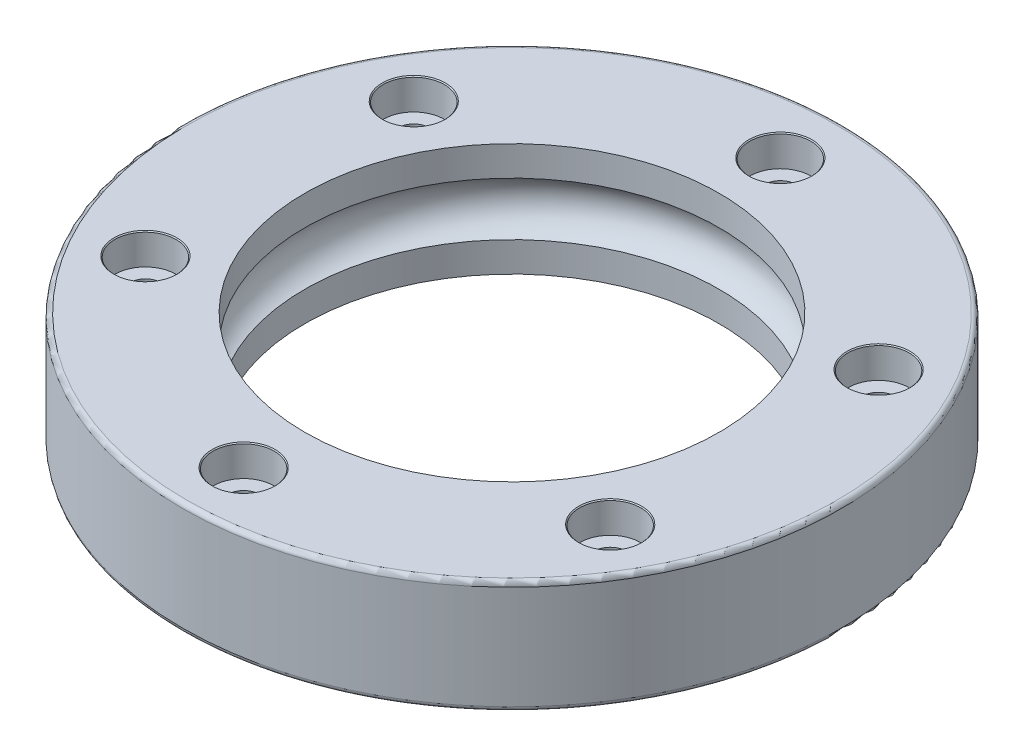
ISO-10303-21;
HEADER;
FILE_DESCRIPTION(('STEP AP214'),'2;1');
FILE_NAME('part.step','',(''),(''),'','','');
FILE_SCHEMA(('AUTOMOTIVE_DESIGN { 1 0 10303 214 1 1 1 1 }'));
ENDSEC;
DATA;
#1=APPLICATION_CONTEXT('core data for automotive mechanical design processes');
#2=APPLICATION_PROTOCOL_DEFINITION('international standard','automotive_design',2000,#1);
#3=PRODUCT_CONTEXT('',#1,'mechanical');
#4=PRODUCT('Part','Part','',(#3));
#5=PRODUCT_RELATED_PRODUCT_CATEGORY('part','',(#4));
#6=PRODUCT_DEFINITION_FORMATION('','',#4);
#7=PRODUCT_DEFINITION_CONTEXT('part definition',#1,'design');
#8=PRODUCT_DEFINITION('design','',#6,#7);
#9=PRODUCT_DEFINITION_SHAPE('','',#8);
#10=(LENGTH_UNIT() NAMED_UNIT(*) SI_UNIT(.MILLI.,.METRE.));
#11=(NAMED_UNIT(*) PLANE_ANGLE_UNIT() SI_UNIT($,.RADIAN.));
#12=(NAMED_UNIT(*) SI_UNIT($,.STERADIAN.) SOLID_ANGLE_UNIT());
#13=UNCERTAINTY_MEASURE_WITH_UNIT(LENGTH_MEASURE(1.E-05),#10,'distance_accuracy_value','');
#14=(GEOMETRIC_REPRESENTATION_CONTEXT(3) GLOBAL_UNCERTAINTY_ASSIGNED_CONTEXT((#13)) GLOBAL_UNIT_ASSIGNED_CONTEXT((#10,
#11,#12)) REPRESENTATION_CONTEXT('',''));
#15=CARTESIAN_POINT('',(0.,0.,0.));
#16=DIRECTION('',(0.,0.,1.));
#17=DIRECTION('',(1.,0.,0.));
#18=AXIS2_PLACEMENT_3D('',#15,#16,#17);
#19=CARTESIAN_POINT('',(-24.6817240078559,-14.,-14.2499999999989));
#20=DIRECTION('',(0.,1.,0.));
#21=DIRECTION('',(0.,0.,1.));
#22=AXIS2_PLACEMENT_3D('',#19,#20,#21);
#23=CYLINDRICAL_SURFACE('',#22,1.70000000000123);
#24=CARTESIAN_POINT('',(-24.6817240078559,-6.,-14.2499999999989));
#25=DIRECTION('',(0.,-1.,0.));
#26=DIRECTION('',(0.,0.,-1.));
#27=AXIS2_PLACEMENT_3D('',#24,#25,#26);
#28=CIRCLE('',#27,1.70000000000123);
#29=CARTESIAN_POINT('',(-24.6817240078559,-6.,-15.9500000000002));
#30=VERTEX_POINT('',#29);
#31=EDGE_CURVE('E97',#30,#30,#28,.T.);
#32=ORIENTED_EDGE('',*,*,#31,.T.);
#33=EDGE_LOOP('',(#32));
#34=FACE_BOUND('',#33,.T.);
#35=CARTESIAN_POINT('',(-24.6817240078559,2.7,-14.2499999999989));
#36=DIRECTION('',(0.,1.,0.));
#37=DIRECTION('',(0.,0.,1.));
#38=AXIS2_PLACEMENT_3D('',#35,#36,#37);
#39=CIRCLE('',#38,1.70000000000123);
#40=CARTESIAN_POINT('',(-24.6817240078559,2.7,-12.5499999999977));
#41=VERTEX_POINT('',#40);
#42=EDGE_CURVE('E77',#41,#41,#39,.F.);
#43=ORIENTED_EDGE('',*,*,#42,.F.);
#44=EDGE_LOOP('',(#43));
#45=FACE_BOUND('',#44,.T.);
#46=ADVANCED_FACE('F32',(#34,#45),#23,.F.);
#47=CARTESIAN_POINT('',(-24.6817240078547,-14.,14.2500000000011));
#48=DIRECTION('',(0.,1.,0.));
#49=DIRECTION('',(0.,0.,1.));
#50=AXIS2_PLACEMENT_3D('',#47,#48,#49);
#51=CYLINDRICAL_SURFACE('',#50,1.70000000000231);
#52=CARTESIAN_POINT('',(-24.6817240078547,-6.,14.2500000000011));
#53=DIRECTION('',(0.,-1.,0.));
#54=DIRECTION('',(0.,0.,-1.));
#55=AXIS2_PLACEMENT_3D('',#52,#53,#54);
#56=CIRCLE('',#55,1.70000000000231);
#57=CARTESIAN_POINT('',(-24.6817240078547,-6.,12.5499999999988));
#58=VERTEX_POINT('',#57);
#59=EDGE_CURVE('E133',#58,#58,#56,.T.);
#60=ORIENTED_EDGE('',*,*,#59,.T.);
#61=EDGE_LOOP('',(#60));
#62=FACE_BOUND('',#61,.T.);
#63=CARTESIAN_POINT('',(-24.6817240078547,2.7,14.2500000000011));
#64=DIRECTION('',(0.,1.,0.));
#65=DIRECTION('',(0.,0.,1.));
#66=AXIS2_PLACEMENT_3D('',#63,#64,#65);
#67=CIRCLE('',#66,1.70000000000231);
#68=CARTESIAN_POINT('',(-24.6817240078547,2.7,15.9500000000034));
#69=VERTEX_POINT('',#68);
#70=EDGE_CURVE('E81',#69,#69,#67,.F.);
#71=ORIENTED_EDGE('',*,*,#70,.F.);
#72=EDGE_LOOP('',(#71));
#73=FACE_BOUND('',#72,.T.);
#74=ADVANCED_FACE('F173',(#62,#73),#51,.F.);
#75=CARTESIAN_POINT('',(2.4230756695444E-12,-14.,28.5));
#76=DIRECTION('',(0.,1.,0.));
#77=DIRECTION('',(0.,0.,1.));
#78=AXIS2_PLACEMENT_3D('',#75,#76,#77);
#79=CYLINDRICAL_SURFACE('',#78,1.70000000000251);
#80=CARTESIAN_POINT('',(2.4230756695444E-12,-6.,28.5));
#81=DIRECTION('',(0.,-1.,0.));
#82=DIRECTION('',(0.,0.,-1.));
#83=AXIS2_PLACEMENT_3D('',#80,#81,#82);
#84=CIRCLE('',#83,1.70000000000251);
#85=CARTESIAN_POINT('',(2.4230756695444E-12,-6.,26.7999999999975));
#86=VERTEX_POINT('',#85);
#87=EDGE_CURVE('E130',#86,#86,#84,.T.);
#88=ORIENTED_EDGE('',*,*,#87,.T.);
#89=EDGE_LOOP('',(#88));
#90=FACE_BOUND('',#89,.T.);
#91=CARTESIAN_POINT('',(2.4230756695444E-12,2.7,28.5));
#92=DIRECTION('',(0.,1.,0.));
#93=DIRECTION('',(0.,0.,1.));
#94=AXIS2_PLACEMENT_3D('',#91,#92,#93);
#95=CIRCLE('',#94,1.70000000000251);
#96=CARTESIAN_POINT('',(2.4230756695444E-12,2.7,30.2000000000025));
#97=VERTEX_POINT('',#96);
#98=EDGE_CURVE('E84',#97,#97,#95,.F.);
#99=ORIENTED_EDGE('',*,*,#98,.F.);
#100=EDGE_LOOP('',(#99));
#101=FACE_BOUND('',#100,.T.);
#102=ADVANCED_FACE('F179',(#90,#101),#79,.F.);
#103=CARTESIAN_POINT('',(24.6817240078583,-14.,14.2499999999989));
#104=DIRECTION('',(0.,1.,0.));
#105=DIRECTION('',(0.,0.,1.));
#106=AXIS2_PLACEMENT_3D('',#103,#104,#105);
#107=CYLINDRICAL_SURFACE('',#106,1.70000000000156);
#108=CARTESIAN_POINT('',(24.6817240078583,-6.,14.2499999999989));
#109=DIRECTION('',(0.,-1.,0.));
#110=DIRECTION('',(0.,0.,-1.));
#111=AXIS2_PLACEMENT_3D('',#108,#109,#110);
#112=CIRCLE('',#111,1.70000000000156);
#113=CARTESIAN_POINT('',(24.6817240078583,-6.,12.5499999999974));
#114=VERTEX_POINT('',#113);
#115=EDGE_CURVE('E127',#114,#114,#112,.T.);
#116=ORIENTED_EDGE('',*,*,#115,.T.);
#117=EDGE_LOOP('',(#116));
#118=FACE_BOUND('',#117,.T.);
#119=CARTESIAN_POINT('',(24.6817240078583,2.7,14.2499999999989));
#120=DIRECTION('',(0.,1.,0.));
#121=DIRECTION('',(0.,0.,1.));
#122=AXIS2_PLACEMENT_3D('',#119,#120,#121);
#123=CIRCLE('',#122,1.70000000000156);
#124=CARTESIAN_POINT('',(24.6817240078583,2.7,15.9500000000005));
#125=VERTEX_POINT('',#124);
#126=EDGE_CURVE('E87',#125,#125,#123,.F.);
#127=ORIENTED_EDGE('',*,*,#126,.F.);
#128=EDGE_LOOP('',(#127));
#129=FACE_BOUND('',#128,.T.);
#130=ADVANCED_FACE('F419',(#118,#129),#107,.F.);
#131=CARTESIAN_POINT('',(24.6817240078571,-14.,-14.2500000000011));
#132=DIRECTION('',(0.,1.,0.));
#133=DIRECTION('',(0.,0.,1.));
#134=AXIS2_PLACEMENT_3D('',#131,#132,#133);
#135=CYLINDRICAL_SURFACE('',#134,1.70000000000034);
#136=CARTESIAN_POINT('',(24.6817240078571,-6.,-14.2500000000011));
#137=DIRECTION('',(0.,-1.,0.));
#138=DIRECTION('',(0.,0.,-1.));
#139=AXIS2_PLACEMENT_3D('',#136,#137,#138);
#140=CIRCLE('',#139,1.70000000000034);
#141=CARTESIAN_POINT('',(24.6817240078571,-6.,-15.9500000000014));
#142=VERTEX_POINT('',#141);
#143=EDGE_CURVE('E124',#142,#142,#140,.T.);
#144=ORIENTED_EDGE('',*,*,#143,.T.);
#145=EDGE_LOOP('',(#144));
#146=FACE_BOUND('',#145,.T.);
#147=CARTESIAN_POINT('',(24.6817240078571,2.7,-14.2500000000011));
#148=DIRECTION('',(0.,1.,0.));
#149=DIRECTION('',(0.,0.,1.));
#150=AXIS2_PLACEMENT_3D('',#147,#148,#149);
#151=CIRCLE('',#150,1.70000000000034);
#152=CARTESIAN_POINT('',(24.6817240078571,2.7,-12.5500000000007));
#153=VERTEX_POINT('',#152);
#154=EDGE_CURVE('E90',#153,#153,#151,.F.);
#155=ORIENTED_EDGE('',*,*,#154,.F.);
#156=EDGE_LOOP('',(#155));
#157=FACE_BOUND('',#156,.T.);
#158=ADVANCED_FACE('F189',(#146,#157),#135,.F.);
#159=CARTESIAN_POINT('',(0.,-14.,-28.5));
#160=DIRECTION('',(0.,1.,0.));
#161=DIRECTION('',(0.,0.,1.));
#162=AXIS2_PLACEMENT_3D('',#159,#160,#161);
#163=CYLINDRICAL_SURFACE('',#162,1.7);
#164=CARTESIAN_POINT('',(0.,-6.,-28.5));
#165=DIRECTION('',(0.,-1.,0.));
#166=DIRECTION('',(0.,0.,-1.));
#167=AXIS2_PLACEMENT_3D('',#164,#165,#166);
#168=CIRCLE('',#167,1.7);
#169=CARTESIAN_POINT('',(0.,-6.,-30.2));
#170=VERTEX_POINT('',#169);
#171=EDGE_CURVE('E121',#170,#170,#168,.T.);
#172=ORIENTED_EDGE('',*,*,#171,.T.);
#173=EDGE_LOOP('',(#172));
#174=FACE_BOUND('',#173,.T.);
#175=CARTESIAN_POINT('',(0.,2.7,-28.5));
#176=DIRECTION('',(0.,1.,0.));
#177=DIRECTION('',(0.,0.,1.));
#178=AXIS2_PLACEMENT_3D('',#175,#176,#177);
#179=CIRCLE('',#178,1.7);
#180=CARTESIAN_POINT('',(0.,2.7,-26.8));
#181=VERTEX_POINT('',#180);
#182=EDGE_CURVE('E94',#181,#181,#179,.F.);
#183=ORIENTED_EDGE('',*,*,#182,.F.);
#184=EDGE_LOOP('',(#183));
#185=FACE_BOUND('',#184,.T.);
#186=ADVANCED_FACE('F185',(#174,#185),#163,.F.);
#187=CARTESIAN_POINT('',(-22.,-6.,0.));
#188=DIRECTION('',(0.,-1.,0.));
#189=DIRECTION('',(0.,0.,-1.));
#190=AXIS2_PLACEMENT_3D('',#187,#188,#189);
#191=PLANE('',#190);
#192=ORIENTED_EDGE('',*,*,#143,.F.);
#193=EDGE_LOOP('',(#192));
#194=FACE_BOUND('',#193,.T.);
#195=ORIENTED_EDGE('',*,*,#115,.F.);
#196=EDGE_LOOP('',(#195));
#197=FACE_BOUND('',#196,.T.);
#198=ORIENTED_EDGE('',*,*,#87,.F.);
#199=EDGE_LOOP('',(#198));
#200=FACE_BOUND('',#199,.T.);
#201=ORIENTED_EDGE('',*,*,#59,.F.);
#202=EDGE_LOOP('',(#201));
#203=FACE_BOUND('',#202,.T.);
#204=ORIENTED_EDGE('',*,*,#31,.F.);
#205=EDGE_LOOP('',(#204));
#206=FACE_BOUND('',#205,.T.);
#207=ORIENTED_EDGE('',*,*,#171,.F.);
#208=EDGE_LOOP('',(#207));
#209=FACE_BOUND('',#208,.T.);
#210=CARTESIAN_POINT('',(0.,-6.,0.));
#211=DIRECTION('',(0.,-1.,0.));
#212=DIRECTION('',(0.,0.,-1.));
#213=AXIS2_PLACEMENT_3D('',#210,#211,#212);
#214=CIRCLE('',#213,34.5);
#215=CARTESIAN_POINT('',(0.,-6.,-34.5));
#216=VERTEX_POINT('',#215);
#217=EDGE_CURVE('E100',#216,#216,#214,.T.);
#218=ORIENTED_EDGE('',*,*,#217,.T.);
#219=EDGE_LOOP('',(#218));
#220=FACE_BOUND('',#219,.T.);
#221=CARTESIAN_POINT('',(0.,-6.,0.));
#222=DIRECTION('',(0.,1.,0.));
#223=DIRECTION('',(0.,0.,1.));
#224=AXIS2_PLACEMENT_3D('',#221,#222,#223);
#225=CIRCLE('',#224,22.);
#226=CARTESIAN_POINT('',(0.,-6.,22.));
#227=VERTEX_POINT('',#226);
#228=EDGE_CURVE('E109',#227,#227,#225,.T.);
#229=ORIENTED_EDGE('',*,*,#228,.T.);
#230=EDGE_LOOP('',(#229));
#231=FACE_BOUND('',#230,.T.);
#232=ADVANCED_FACE('F188',(#194,#197,#200,#203,#206,#209,#220,#231),#191,.T.);
#233=CARTESIAN_POINT('',(0.,15.8769514141379,0.));
#234=DIRECTION('',(0.,1.,0.));
#235=DIRECTION('',(0.,0.,1.));
#236=AXIS2_PLACEMENT_3D('',#233,#234,#235);
#237=CYLINDRICAL_SURFACE('',#236,22.);
#238=CARTESIAN_POINT('',(0.,-2.82842712474619,0.));
#239=DIRECTION('',(0.,1.,0.));
#240=DIRECTION('',(0.,0.,1.));
#241=AXIS2_PLACEMENT_3D('',#238,#239,#240);
#242=CIRCLE('',#241,22.);
#243=CARTESIAN_POINT('',(0.,-2.82842712474619,22.));
#244=VERTEX_POINT('',#243);
#245=EDGE_CURVE('E112',#244,#244,#242,.T.);
#246=ORIENTED_EDGE('',*,*,#245,.T.);
#247=EDGE_LOOP('',(#246));
#248=FACE_BOUND('',#247,.T.);
#249=ORIENTED_EDGE('',*,*,#228,.F.);
#250=EDGE_LOOP('',(#249));
#251=FACE_BOUND('',#250,.T.);
#252=ADVANCED_FACE('F207',(#248,#251),#237,.F.);
#253=CARTESIAN_POINT('',(0.,0.,0.));
#254=DIRECTION('',(0.,1.,0.));
#255=DIRECTION('',(0.,0.,1.));
#256=AXIS2_PLACEMENT_3D('',#253,#254,#255);
#257=TOROIDAL_SURFACE('',#256,21.,3.);
#258=CARTESIAN_POINT('',(0.,2.82842712474619,0.));
#259=DIRECTION('',(0.,1.,0.));
#260=DIRECTION('',(0.,0.,1.));
#261=AXIS2_PLACEMENT_3D('',#258,#259,#260);
#262=CIRCLE('',#261,22.);
#263=CARTESIAN_POINT('',(0.,2.82842712474619,22.));
#264=VERTEX_POINT('',#263);
#265=EDGE_CURVE('E115',#264,#264,#262,.T.);
#266=ORIENTED_EDGE('',*,*,#265,.T.);
#267=EDGE_LOOP('',(#266));
#268=FACE_BOUND('',#267,.T.);
#269=ORIENTED_EDGE('',*,*,#245,.F.);
#270=EDGE_LOOP('',(#269));
#271=FACE_BOUND('',#270,.T.);
#272=ADVANCED_FACE('F203',(#268,#271),#257,.F.);
#273=CARTESIAN_POINT('',(0.,15.8769514141379,0.));
#274=DIRECTION('',(0.,1.,0.));
#275=DIRECTION('',(0.,0.,1.));
#276=AXIS2_PLACEMENT_3D('',#273,#274,#275);
#277=CYLINDRICAL_SURFACE('',#276,22.);
#278=CARTESIAN_POINT('',(0.,6.,0.));
#279=DIRECTION('',(0.,1.,0.));
#280=DIRECTION('',(0.,0.,1.));
#281=AXIS2_PLACEMENT_3D('',#278,#279,#280);
#282=CIRCLE('',#281,22.);
#283=CARTESIAN_POINT('',(0.,6.,22.));
#284=VERTEX_POINT('',#283);
#285=EDGE_CURVE('E118',#284,#284,#282,.T.);
#286=ORIENTED_EDGE('',*,*,#285,.T.);
#287=EDGE_LOOP('',(#286));
#288=FACE_BOUND('',#287,.T.);
#289=ORIENTED_EDGE('',*,*,#265,.F.);
#290=EDGE_LOOP('',(#289));
#291=FACE_BOUND('',#290,.T.);
#292=ADVANCED_FACE('F199',(#288,#291),#277,.F.);
#293=CARTESIAN_POINT('',(-22.,6.,0.));
#294=DIRECTION('',(0.,1.,0.));
#295=DIRECTION('',(0.,0.,1.));
#296=AXIS2_PLACEMENT_3D('',#293,#294,#295);
#297=PLANE('',#296);
#298=CARTESIAN_POINT('',(24.6817240078583,6.,14.2499999999989));
#299=DIRECTION('',(0.,1.,0.));
#300=DIRECTION('',(0.,0.,1.));
#301=AXIS2_PLACEMENT_3D('',#298,#299,#300);
#302=CIRCLE('',#301,3.35000000000157);
#303=CARTESIAN_POINT('',(24.6817240078583,6.,17.6000000000005));
#304=VERTEX_POINT('',#303);
#305=EDGE_CURVE('E55',#304,#304,#302,.F.);
#306=ORIENTED_EDGE('',*,*,#305,.T.);
#307=EDGE_LOOP('',(#306));
#308=FACE_BOUND('',#307,.T.);
#309=CARTESIAN_POINT('',(24.6817240078571,6.,-14.2500000000011));
#310=DIRECTION('',(0.,1.,0.));
#311=DIRECTION('',(0.,0.,1.));
#312=AXIS2_PLACEMENT_3D('',#309,#310,#311);
#313=CIRCLE('',#312,3.35000000000037);
#314=CARTESIAN_POINT('',(24.6817240078571,6.,-10.9000000000007));
#315=VERTEX_POINT('',#314);
#316=EDGE_CURVE('E58',#315,#315,#313,.F.);
#317=ORIENTED_EDGE('',*,*,#316,.T.);
#318=EDGE_LOOP('',(#317));
#319=FACE_BOUND('',#318,.T.);
#320=CARTESIAN_POINT('',(0.,6.,-28.5));
#321=DIRECTION('',(0.,1.,0.));
#322=DIRECTION('',(0.,0.,1.));
#323=AXIS2_PLACEMENT_3D('',#320,#321,#322);
#324=CIRCLE('',#323,3.35);
#325=CARTESIAN_POINT('',(0.,6.,-25.15));
#326=VERTEX_POINT('',#325);
#327=EDGE_CURVE('E61',#326,#326,#324,.F.);
#328=ORIENTED_EDGE('',*,*,#327,.T.);
#329=EDGE_LOOP('',(#328));
#330=FACE_BOUND('',#329,.T.);
#331=CARTESIAN_POINT('',(-24.6817240078559,6.,-14.2499999999989));
#332=DIRECTION('',(0.,1.,0.));
#333=DIRECTION('',(0.,0.,1.));
#334=AXIS2_PLACEMENT_3D('',#331,#332,#333);
#335=CIRCLE('',#334,3.35000000000124);
#336=CARTESIAN_POINT('',(-24.6817240078559,6.,-10.8999999999977));
#337=VERTEX_POINT('',#336);
#338=EDGE_CURVE('E64',#337,#337,#335,.F.);
#339=ORIENTED_EDGE('',*,*,#338,.T.);
#340=EDGE_LOOP('',(#339));
#341=FACE_BOUND('',#340,.T.);
#342=CARTESIAN_POINT('',(-24.6817240078547,6.,14.2500000000011));
#343=DIRECTION('',(0.,1.,0.));
#344=DIRECTION('',(0.,0.,1.));
#345=AXIS2_PLACEMENT_3D('',#342,#343,#344);
#346=CIRCLE('',#345,3.35000000000232);
#347=CARTESIAN_POINT('',(-24.6817240078547,6.,17.6000000000034));
#348=VERTEX_POINT('',#347);
#349=EDGE_CURVE('E67',#348,#348,#346,.F.);
#350=ORIENTED_EDGE('',*,*,#349,.T.);
#351=EDGE_LOOP('',(#350));
#352=FACE_BOUND('',#351,.T.);
#353=CARTESIAN_POINT('',(2.4230756695444E-12,6.,28.5));
#354=DIRECTION('',(0.,1.,0.));
#355=DIRECTION('',(0.,0.,1.));
#356=AXIS2_PLACEMENT_3D('',#353,#354,#355);
#357=CIRCLE('',#356,3.35000000000252);
#358=CARTESIAN_POINT('',(2.4230756695444E-12,6.,31.8500000000025));
#359=VERTEX_POINT('',#358);
#360=EDGE_CURVE('E70',#359,#359,#357,.F.);
#361=ORIENTED_EDGE('',*,*,#360,.T.);
#362=EDGE_LOOP('',(#361));
#363=FACE_BOUND('',#362,.T.);
#364=CARTESIAN_POINT('',(0.,6.,0.));
#365=DIRECTION('',(0.,1.,0.));
#366=DIRECTION('',(0.,0.,1.));
#367=AXIS2_PLACEMENT_3D('',#364,#365,#366);
#368=CIRCLE('',#367,34.5);
#369=CARTESIAN_POINT('',(0.,6.,34.5));
#370=VERTEX_POINT('',#369);
#371=EDGE_CURVE('E76',#370,#370,#368,.T.);
#372=ORIENTED_EDGE('',*,*,#371,.T.);
#373=EDGE_LOOP('',(#372));
#374=FACE_BOUND('',#373,.T.);
#375=ORIENTED_EDGE('',*,*,#285,.F.);
#376=EDGE_LOOP('',(#375));
#377=FACE_BOUND('',#376,.T.);
#378=ADVANCED_FACE('F195',(#308,#319,#330,#341,#352,#363,#374,#377),#297,.T.);
#379=CARTESIAN_POINT('',(0.,15.8769514141379,0.));
#380=DIRECTION('',(0.,1.,0.));
#381=DIRECTION('',(0.,0.,1.));
#382=AXIS2_PLACEMENT_3D('',#379,#380,#381);
#383=CYLINDRICAL_SURFACE('',#382,35.);
#384=CARTESIAN_POINT('',(0.,-5.5,0.));
#385=DIRECTION('',(0.,-1.,0.));
#386=DIRECTION('',(0.,0.,-1.));
#387=AXIS2_PLACEMENT_3D('',#384,#385,#386);
#388=CIRCLE('',#387,35.);
#389=CARTESIAN_POINT('',(0.,-5.5,-35.));
#390=VERTEX_POINT('',#389);
#391=EDGE_CURVE('E103',#390,#390,#388,.F.);
#392=ORIENTED_EDGE('',*,*,#391,.T.);
#393=EDGE_LOOP('',(#392));
#394=FACE_BOUND('',#393,.T.);
#395=CARTESIAN_POINT('',(0.,5.5,0.));
#396=DIRECTION('',(0.,1.,0.));
#397=DIRECTION('',(0.,0.,1.));
#398=AXIS2_PLACEMENT_3D('',#395,#396,#397);
#399=CIRCLE('',#398,35.);
#400=CARTESIAN_POINT('',(0.,5.5,35.));
#401=VERTEX_POINT('',#400);
#402=EDGE_CURVE('E106',#401,#401,#399,.F.);
#403=ORIENTED_EDGE('',*,*,#402,.T.);
#404=EDGE_LOOP('',(#403));
#405=FACE_BOUND('',#404,.T.);
#406=ADVANCED_FACE('F191',(#394,#405),#383,.T.);
#407=CARTESIAN_POINT('',(0.,-5.5,0.));
#408=DIRECTION('',(0.,-1.,0.));
#409=DIRECTION('',(0.,0.,-1.));
#410=AXIS2_PLACEMENT_3D('',#407,#408,#409);
#411=TOROIDAL_SURFACE('',#410,34.5,0.5);
#412=ORIENTED_EDGE('',*,*,#217,.F.);
#413=EDGE_LOOP('',(#412));
#414=FACE_BOUND('',#413,.T.);
#415=ORIENTED_EDGE('',*,*,#391,.F.);
#416=EDGE_LOOP('',(#415));
#417=FACE_BOUND('',#416,.T.);
#418=ADVANCED_FACE('F194',(#414,#417),#411,.T.);
#419=CARTESIAN_POINT('',(0.,5.5,0.));
#420=DIRECTION('',(0.,1.,0.));
#421=DIRECTION('',(0.,0.,1.));
#422=AXIS2_PLACEMENT_3D('',#419,#420,#421);
#423=TOROIDAL_SURFACE('',#422,34.5,0.5);
#424=ORIENTED_EDGE('',*,*,#402,.F.);
#425=EDGE_LOOP('',(#424));
#426=FACE_BOUND('',#425,.T.);
#427=ORIENTED_EDGE('',*,*,#371,.F.);
#428=EDGE_LOOP('',(#427));
#429=FACE_BOUND('',#428,.T.);
#430=ADVANCED_FACE('F217',(#426,#429),#423,.T.);
#431=CARTESIAN_POINT('',(0.,2.7,-28.5));
#432=DIRECTION('',(0.,1.,0.));
#433=DIRECTION('',(0.,0.,1.));
#434=AXIS2_PLACEMENT_3D('',#431,#432,#433);
#435=PLANE('',#434);
#436=CARTESIAN_POINT('',(0.,2.7,-28.5));
#437=DIRECTION('',(0.,1.,0.));
#438=DIRECTION('',(0.,0.,1.));
#439=AXIS2_PLACEMENT_3D('',#436,#437,#438);
#440=CIRCLE('',#439,3.25);
#441=CARTESIAN_POINT('',(0.,2.7,-25.25));
#442=VERTEX_POINT('',#441);
#443=EDGE_CURVE('E80',#442,#442,#440,.T.);
#444=ORIENTED_EDGE('',*,*,#443,.T.);
#445=EDGE_LOOP('',(#444));
#446=FACE_BOUND('',#445,.T.);
#447=ORIENTED_EDGE('',*,*,#182,.T.);
#448=EDGE_LOOP('',(#447));
#449=FACE_BOUND('',#448,.T.);
#450=ADVANCED_FACE('F221',(#446,#449),#435,.T.);
#451=CARTESIAN_POINT('',(0.,2.7,-28.5));
#452=DIRECTION('',(0.,1.,0.));
#453=DIRECTION('',(0.,0.,1.));
#454=AXIS2_PLACEMENT_3D('',#451,#452,#453);
#455=CYLINDRICAL_SURFACE('',#454,3.25);
#456=CARTESIAN_POINT('',(0.,5.89999999999999,-28.5));
#457=DIRECTION('',(0.,1.,0.));
#458=DIRECTION('',(0.,0.,1.));
#459=AXIS2_PLACEMENT_3D('',#456,#457,#458);
#460=CIRCLE('',#459,3.25);
#461=CARTESIAN_POINT('',(0.,5.89999999999999,-25.25));
#462=VERTEX_POINT('',#461);
#463=EDGE_CURVE('E47',#462,#462,#460,.T.);
#464=ORIENTED_EDGE('',*,*,#463,.T.);
#465=EDGE_LOOP('',(#464));
#466=FACE_BOUND('',#465,.T.);
#467=ORIENTED_EDGE('',*,*,#443,.F.);
#468=EDGE_LOOP('',(#467));
#469=FACE_BOUND('',#468,.T.);
#470=ADVANCED_FACE('F170',(#466,#469),#455,.F.);
#471=CARTESIAN_POINT('',(24.6817240078571,2.7,-14.2500000000011));
#472=DIRECTION('',(0.,1.,0.));
#473=DIRECTION('',(0.,0.,1.));
#474=AXIS2_PLACEMENT_3D('',#471,#472,#473);
#475=PLANE('',#474);
#476=CARTESIAN_POINT('',(24.6817240078571,2.7,-14.2500000000011));
#477=DIRECTION('',(0.,1.,0.));
#478=DIRECTION('',(0.,0.,1.));
#479=AXIS2_PLACEMENT_3D('',#476,#477,#478);
#480=CIRCLE('',#479,3.25000000000034);
#481=CARTESIAN_POINT('',(24.6817240078571,2.7,-11.0000000000007));
#482=VERTEX_POINT('',#481);
#483=EDGE_CURVE('E93',#482,#482,#480,.T.);
#484=ORIENTED_EDGE('',*,*,#483,.T.);
#485=EDGE_LOOP('',(#484));
#486=FACE_BOUND('',#485,.T.);
#487=ORIENTED_EDGE('',*,*,#154,.T.);
#488=EDGE_LOOP('',(#487));
#489=FACE_BOUND('',#488,.T.);
#490=ADVANCED_FACE('F155',(#486,#489),#475,.T.);
#491=CARTESIAN_POINT('',(24.6817240078571,2.7,-14.2500000000011));
#492=DIRECTION('',(0.,1.,0.));
#493=DIRECTION('',(0.,0.,1.));
#494=AXIS2_PLACEMENT_3D('',#491,#492,#493);
#495=CYLINDRICAL_SURFACE('',#494,3.25000000000034);
#496=CARTESIAN_POINT('',(24.6817240078571,5.89999999999999,-14.2500000000011));
#497=DIRECTION('',(0.,1.,0.));
#498=DIRECTION('',(0.,0.,1.));
#499=AXIS2_PLACEMENT_3D('',#496,#497,#498);
#500=CIRCLE('',#499,3.25000000000034);
#501=CARTESIAN_POINT('',(24.6817240078571,5.89999999999999,-11.0000000000007));
#502=VERTEX_POINT('',#501);
#503=EDGE_CURVE('E52',#502,#502,#500,.T.);
#504=ORIENTED_EDGE('',*,*,#503,.T.);
#505=EDGE_LOOP('',(#504));
#506=FACE_BOUND('',#505,.T.);
#507=ORIENTED_EDGE('',*,*,#483,.F.);
#508=EDGE_LOOP('',(#507));
#509=FACE_BOUND('',#508,.T.);
#510=ADVANCED_FACE('F158',(#506,#509),#495,.F.);
#511=CARTESIAN_POINT('',(24.6817240078583,2.7,14.2499999999989));
#512=DIRECTION('',(0.,1.,0.));
#513=DIRECTION('',(0.,0.,1.));
#514=AXIS2_PLACEMENT_3D('',#511,#512,#513);
#515=PLANE('',#514);
#516=CARTESIAN_POINT('',(24.6817240078583,2.7,14.2499999999989));
#517=DIRECTION('',(0.,1.,0.));
#518=DIRECTION('',(0.,0.,1.));
#519=AXIS2_PLACEMENT_3D('',#516,#517,#518);
#520=CIRCLE('',#519,3.25000000000156);
#521=CARTESIAN_POINT('',(24.6817240078583,2.7,17.5000000000005));
#522=VERTEX_POINT('',#521);
#523=EDGE_CURVE('E149',#522,#522,#520,.T.);
#524=ORIENTED_EDGE('',*,*,#523,.T.);
#525=EDGE_LOOP('',(#524));
#526=FACE_BOUND('',#525,.T.);
#527=ORIENTED_EDGE('',*,*,#126,.T.);
#528=EDGE_LOOP('',(#527));
#529=FACE_BOUND('',#528,.T.);
#530=ADVANCED_FACE('F160',(#526,#529),#515,.T.);
#531=CARTESIAN_POINT('',(24.6817240078583,2.7,14.2499999999989));
#532=DIRECTION('',(0.,1.,0.));
#533=DIRECTION('',(0.,0.,1.));
#534=AXIS2_PLACEMENT_3D('',#531,#532,#533);
#535=CYLINDRICAL_SURFACE('',#534,3.25000000000156);
#536=CARTESIAN_POINT('',(24.6817240078583,5.9,14.2499999999989));
#537=DIRECTION('',(0.,1.,0.));
#538=DIRECTION('',(0.,0.,1.));
#539=AXIS2_PLACEMENT_3D('',#536,#537,#538);
#540=CIRCLE('',#539,3.25000000000156);
#541=CARTESIAN_POINT('',(24.6817240078583,5.9,17.5000000000005));
#542=VERTEX_POINT('',#541);
#543=EDGE_CURVE('E73',#542,#542,#540,.T.);
#544=ORIENTED_EDGE('',*,*,#543,.T.);
#545=EDGE_LOOP('',(#544));
#546=FACE_BOUND('',#545,.T.);
#547=ORIENTED_EDGE('',*,*,#523,.F.);
#548=EDGE_LOOP('',(#547));
#549=FACE_BOUND('',#548,.T.);
#550=ADVANCED_FACE('F167',(#546,#549),#535,.F.);
#551=CARTESIAN_POINT('',(2.4230756695444E-12,2.7,28.5));
#552=DIRECTION('',(0.,1.,0.));
#553=DIRECTION('',(0.,0.,1.));
#554=AXIS2_PLACEMENT_3D('',#551,#552,#553);
#555=PLANE('',#554);
#556=CARTESIAN_POINT('',(2.4230756695444E-12,2.7,28.5));
#557=DIRECTION('',(0.,1.,0.));
#558=DIRECTION('',(0.,0.,1.));
#559=AXIS2_PLACEMENT_3D('',#556,#557,#558);
#560=CIRCLE('',#559,3.25000000000251);
#561=CARTESIAN_POINT('',(2.4230756695444E-12,2.7,31.7500000000025));
#562=VERTEX_POINT('',#561);
#563=EDGE_CURVE('E146',#562,#562,#560,.T.);
#564=ORIENTED_EDGE('',*,*,#563,.T.);
#565=EDGE_LOOP('',(#564));
#566=FACE_BOUND('',#565,.T.);
#567=ORIENTED_EDGE('',*,*,#98,.T.);
#568=EDGE_LOOP('',(#567));
#569=FACE_BOUND('',#568,.T.);
#570=ADVANCED_FACE('F328',(#566,#569),#555,.T.);
#571=CARTESIAN_POINT('',(2.4230756695444E-12,2.7,28.5));
#572=DIRECTION('',(0.,1.,0.));
#573=DIRECTION('',(0.,0.,1.));
#574=AXIS2_PLACEMENT_3D('',#571,#572,#573);
#575=CYLINDRICAL_SURFACE('',#574,3.25000000000251);
#576=CARTESIAN_POINT('',(2.4230756695444E-12,5.9,28.5));
#577=DIRECTION('',(0.,1.,0.));
#578=DIRECTION('',(0.,0.,1.));
#579=AXIS2_PLACEMENT_3D('',#576,#577,#578);
#580=CIRCLE('',#579,3.25000000000251);
#581=CARTESIAN_POINT('',(2.4230756695444E-12,5.9,31.7500000000025));
#582=VERTEX_POINT('',#581);
#583=EDGE_CURVE('E10',#582,#582,#580,.T.);
#584=ORIENTED_EDGE('',*,*,#583,.T.);
#585=EDGE_LOOP('',(#584));
#586=FACE_BOUND('',#585,.T.);
#587=ORIENTED_EDGE('',*,*,#563,.F.);
#588=EDGE_LOOP('',(#587));
#589=FACE_BOUND('',#588,.T.);
#590=ADVANCED_FACE('F323',(#586,#589),#575,.F.);
#591=CARTESIAN_POINT('',(-24.6817240078547,2.7,14.2500000000011));
#592=DIRECTION('',(0.,1.,0.));
#593=DIRECTION('',(0.,0.,1.));
#594=AXIS2_PLACEMENT_3D('',#591,#592,#593);
#595=PLANE('',#594);
#596=CARTESIAN_POINT('',(-24.6817240078547,2.7,14.2500000000011));
#597=DIRECTION('',(0.,1.,0.));
#598=DIRECTION('',(0.,0.,1.));
#599=AXIS2_PLACEMENT_3D('',#596,#597,#598);
#600=CIRCLE('',#599,3.25000000000231);
#601=CARTESIAN_POINT('',(-24.6817240078547,2.7,17.5000000000034));
#602=VERTEX_POINT('',#601);
#603=EDGE_CURVE('E143',#602,#602,#600,.T.);
#604=ORIENTED_EDGE('',*,*,#603,.T.);
#605=EDGE_LOOP('',(#604));
#606=FACE_BOUND('',#605,.T.);
#607=ORIENTED_EDGE('',*,*,#70,.T.);
#608=EDGE_LOOP('',(#607));
#609=FACE_BOUND('',#608,.T.);
#610=ADVANCED_FACE('F316',(#606,#609),#595,.T.);
#611=CARTESIAN_POINT('',(-24.6817240078547,2.7,14.2500000000011));
#612=DIRECTION('',(0.,1.,0.));
#613=DIRECTION('',(0.,0.,1.));
#614=AXIS2_PLACEMENT_3D('',#611,#612,#613);
#615=CYLINDRICAL_SURFACE('',#614,3.25000000000231);
#616=CARTESIAN_POINT('',(-24.6817240078547,5.9,14.2500000000011));
#617=DIRECTION('',(0.,1.,0.));
#618=DIRECTION('',(0.,0.,1.));
#619=AXIS2_PLACEMENT_3D('',#616,#617,#618);
#620=CIRCLE('',#619,3.25000000000231);
#621=CARTESIAN_POINT('',(-24.6817240078547,5.9,17.5000000000034));
#622=VERTEX_POINT('',#621);
#623=EDGE_CURVE('E39',#622,#622,#620,.T.);
#624=ORIENTED_EDGE('',*,*,#623,.T.);
#625=EDGE_LOOP('',(#624));
#626=FACE_BOUND('',#625,.T.);
#627=ORIENTED_EDGE('',*,*,#603,.F.);
#628=EDGE_LOOP('',(#627));
#629=FACE_BOUND('',#628,.T.);
#630=ADVANCED_FACE('F311',(#626,#629),#615,.F.);
#631=CARTESIAN_POINT('',(-24.6817240078559,2.7,-14.2499999999989));
#632=DIRECTION('',(0.,1.,0.));
#633=DIRECTION('',(0.,0.,1.));
#634=AXIS2_PLACEMENT_3D('',#631,#632,#633);
#635=PLANE('',#634);
#636=CARTESIAN_POINT('',(-24.6817240078559,2.7,-14.2499999999989));
#637=DIRECTION('',(0.,1.,0.));
#638=DIRECTION('',(0.,0.,1.));
#639=AXIS2_PLACEMENT_3D('',#636,#637,#638);
#640=CIRCLE('',#639,3.25000000000123);
#641=CARTESIAN_POINT('',(-24.6817240078559,2.7,-10.9999999999977));
#642=VERTEX_POINT('',#641);
#643=EDGE_CURVE('E140',#642,#642,#640,.T.);
#644=ORIENTED_EDGE('',*,*,#643,.T.);
#645=EDGE_LOOP('',(#644));
#646=FACE_BOUND('',#645,.T.);
#647=ORIENTED_EDGE('',*,*,#42,.T.);
#648=EDGE_LOOP('',(#647));
#649=FACE_BOUND('',#648,.T.);
#650=ADVANCED_FACE('F303',(#646,#649),#635,.T.);
#651=CARTESIAN_POINT('',(-24.6817240078559,2.7,-14.2499999999989));
#652=DIRECTION('',(0.,1.,0.));
#653=DIRECTION('',(0.,0.,1.));
#654=AXIS2_PLACEMENT_3D('',#651,#652,#653);
#655=CYLINDRICAL_SURFACE('',#654,3.25000000000123);
#656=CARTESIAN_POINT('',(-24.6817240078559,5.9,-14.2499999999989));
#657=DIRECTION('',(0.,1.,0.));
#658=DIRECTION('',(0.,0.,1.));
#659=AXIS2_PLACEMENT_3D('',#656,#657,#658);
#660=CIRCLE('',#659,3.25000000000123);
#661=CARTESIAN_POINT('',(-24.6817240078559,5.9,-10.9999999999977));
#662=VERTEX_POINT('',#661);
#663=EDGE_CURVE('E43',#662,#662,#660,.T.);
#664=ORIENTED_EDGE('',*,*,#663,.T.);
#665=EDGE_LOOP('',(#664));
#666=FACE_BOUND('',#665,.T.);
#667=ORIENTED_EDGE('',*,*,#643,.F.);
#668=EDGE_LOOP('',(#667));
#669=FACE_BOUND('',#668,.T.);
#670=ADVANCED_FACE('F227',(#666,#669),#655,.F.);
#671=CARTESIAN_POINT('',(24.6817240078583,5.9,14.2499999999989));
#672=DIRECTION('',(0.,1.,0.));
#673=DIRECTION('',(0.,0.,1.));
#674=AXIS2_PLACEMENT_3D('',#671,#672,#673);
#675=CONICAL_SURFACE('',#674,3.25000000000156,0.785398163397505);
#676=ORIENTED_EDGE('',*,*,#305,.F.);
#677=EDGE_LOOP('',(#676));
#678=FACE_BOUND('',#677,.T.);
#679=ORIENTED_EDGE('',*,*,#543,.F.);
#680=EDGE_LOOP('',(#679));
#681=FACE_BOUND('',#680,.T.);
#682=ADVANCED_FACE('F223',(#678,#681),#675,.F.);
#683=CARTESIAN_POINT('',(24.6817240078571,5.89999999999999,-14.2500000000011));
#684=DIRECTION('',(0.,1.,0.));
#685=DIRECTION('',(0.,0.,1.));
#686=AXIS2_PLACEMENT_3D('',#683,#684,#685);
#687=CONICAL_SURFACE('',#686,3.25000000000034,0.785398163397507);
#688=CARTESIAN_POINT('',(24.6817240078571,6.,-10.9000000000007));
#689=CARTESIAN_POINT('',(24.6817240078571,5.99895833333333,-10.9010416666674));
#690=CARTESIAN_POINT('',(24.6817240078571,5.99791666666667,-10.902083333334));
#691=CARTESIAN_POINT('',(24.6817240078571,5.99583333333333,-10.9041666666674));
#692=CARTESIAN_POINT('',(24.6817240078571,5.99479166666667,-10.905208333334));
#693=CARTESIAN_POINT('',(24.6817240078571,5.99270833333333,-10.9072916666674));
#694=CARTESIAN_POINT('',(24.6817240078571,5.99166666666666,-10.908333333334));
#695=CARTESIAN_POINT('',(24.6817240078571,5.98958333333333,-10.9104166666674));
#696=CARTESIAN_POINT('',(24.6817240078571,5.98854166666666,-10.911458333334));
#697=CARTESIAN_POINT('',(24.6817240078571,5.98645833333333,-10.9135416666674));
#698=CARTESIAN_POINT('',(24.6817240078571,5.98541666666666,-10.914583333334));
#699=CARTESIAN_POINT('',(24.6817240078571,5.98333333333333,-10.9166666666674));
#700=CARTESIAN_POINT('',(24.6817240078571,5.98229166666666,-10.917708333334));
#701=CARTESIAN_POINT('',(24.6817240078571,5.98020833333333,-10.9197916666674));
#702=CARTESIAN_POINT('',(24.6817240078571,5.97916666666666,-10.920833333334));
#703=CARTESIAN_POINT('',(24.6817240078571,5.97708333333333,-10.9229166666674));
#704=CARTESIAN_POINT('',(24.6817240078571,5.97604166666666,-10.923958333334));
#705=CARTESIAN_POINT('',(24.6817240078571,5.97395833333333,-10.9260416666674));
#706=CARTESIAN_POINT('',(24.6817240078571,5.97291666666666,-10.927083333334));
#707=CARTESIAN_POINT('',(24.6817240078571,5.97083333333333,-10.9291666666674));
#708=CARTESIAN_POINT('',(24.6817240078571,5.96979166666666,-10.930208333334));
#709=CARTESIAN_POINT('',(24.6817240078571,5.96770833333333,-10.9322916666674));
#710=CARTESIAN_POINT('',(24.6817240078571,5.96666666666666,-10.933333333334));
#711=CARTESIAN_POINT('',(24.6817240078571,5.96458333333333,-10.9354166666674));
#712=CARTESIAN_POINT('',(24.6817240078571,5.96354166666666,-10.936458333334));
#713=CARTESIAN_POINT('',(24.6817240078571,5.96145833333333,-10.9385416666674));
#714=CARTESIAN_POINT('',(24.6817240078571,5.96041666666666,-10.939583333334));
#715=CARTESIAN_POINT('',(24.6817240078571,5.95833333333333,-10.9416666666674));
#716=CARTESIAN_POINT('',(24.6817240078571,5.95729166666666,-10.942708333334));
#717=CARTESIAN_POINT('',(24.6817240078571,5.95520833333333,-10.9447916666674));
#718=CARTESIAN_POINT('',(24.6817240078571,5.95416666666666,-10.945833333334));
#719=CARTESIAN_POINT('',(24.6817240078571,5.95208333333333,-10.9479166666674));
#720=CARTESIAN_POINT('',(24.6817240078571,5.95104166666666,-10.948958333334));
#721=CARTESIAN_POINT('',(24.6817240078571,5.94895833333333,-10.9510416666674));
#722=CARTESIAN_POINT('',(24.6817240078571,5.94791666666666,-10.952083333334));
#723=CARTESIAN_POINT('',(24.6817240078571,5.94583333333333,-10.9541666666674));
#724=CARTESIAN_POINT('',(24.6817240078571,5.94479166666666,-10.955208333334));
#725=CARTESIAN_POINT('',(24.6817240078571,5.94270833333333,-10.9572916666674));
#726=CARTESIAN_POINT('',(24.6817240078571,5.94166666666666,-10.958333333334));
#727=CARTESIAN_POINT('',(24.6817240078571,5.93958333333332,-10.9604166666674));
#728=CARTESIAN_POINT('',(24.6817240078571,5.93854166666666,-10.961458333334));
#729=CARTESIAN_POINT('',(24.6817240078571,5.93645833333332,-10.9635416666674));
#730=CARTESIAN_POINT('',(24.6817240078571,5.93541666666666,-10.964583333334));
#731=CARTESIAN_POINT('',(24.6817240078571,5.93333333333332,-10.9666666666674));
#732=CARTESIAN_POINT('',(24.6817240078571,5.93229166666666,-10.967708333334));
#733=CARTESIAN_POINT('',(24.6817240078571,5.93020833333332,-10.9697916666674));
#734=CARTESIAN_POINT('',(24.6817240078571,5.92916666666666,-10.970833333334));
#735=CARTESIAN_POINT('',(24.6817240078571,5.92708333333332,-10.9729166666674));
#736=CARTESIAN_POINT('',(24.6817240078571,5.92604166666665,-10.973958333334));
#737=CARTESIAN_POINT('',(24.6817240078571,5.92395833333332,-10.9760416666674));
#738=CARTESIAN_POINT('',(24.6817240078571,5.92291666666666,-10.977083333334));
#739=CARTESIAN_POINT('',(24.6817240078571,5.92083333333332,-10.9791666666674));
#740=CARTESIAN_POINT('',(24.6817240078571,5.91979166666666,-10.980208333334));
#741=CARTESIAN_POINT('',(24.6817240078571,5.91770833333332,-10.9822916666674));
#742=CARTESIAN_POINT('',(24.6817240078571,5.91666666666666,-10.983333333334));
#743=CARTESIAN_POINT('',(24.6817240078571,5.91458333333332,-10.9854166666674));
#744=CARTESIAN_POINT('',(24.6817240078571,5.91354166666665,-10.986458333334));
#745=CARTESIAN_POINT('',(24.6817240078571,5.91145833333332,-10.9885416666674));
#746=CARTESIAN_POINT('',(24.6817240078571,5.91041666666665,-10.989583333334));
#747=CARTESIAN_POINT('',(24.6817240078571,5.90833333333332,-10.9916666666674));
#748=CARTESIAN_POINT('',(24.6817240078571,5.90729166666665,-10.992708333334));
#749=CARTESIAN_POINT('',(24.6817240078571,5.90520833333332,-10.9947916666674));
#750=CARTESIAN_POINT('',(24.6817240078571,5.90416666666665,-10.995833333334));
#751=CARTESIAN_POINT('',(24.6817240078571,5.90208333333332,-10.9979166666674));
#752=CARTESIAN_POINT('',(24.6817240078571,5.90104166666665,-10.998958333334));
#753=CARTESIAN_POINT('',(24.6817240078571,5.89999999999999,-11.0000000000007));
#754=B_SPLINE_CURVE_WITH_KNOTS('',3,(#688,#689,#690,#691,#692,#693,#694,#695,#696,#697,#698,
#699,#700,#701,#702,#703,#704,#705,#706,#707,#708,#709,#710,#711,#712,#713,#714,#715,#716,#717,
#718,#719,#720,#721,#722,#723,#724,#725,#726,#727,#728,#729,#730,#731,#732,#733,#734,#735,#736,
#737,#738,#739,#740,#741,#742,#743,#744,#745,#746,#747,#748,#749,#750,#751,#752,#753),
.UNSPECIFIED.,.F.,.F.,(4,2,2,2,2,2,2,2,2,2,2,2,2,2,2,2,2,2,2,2,2,2,2,2,2,2,2,2,2,2,2,2,4),(0.,
0.00441941738241728,0.00883883476483455,0.0132582521472506,0.0176776695296679,
0.0220970869120852,0.0265165042945012,0.0309359216769185,0.0353553390593351,0.0397747564417512,
0.0441941738241685,0.0486135912065845,0.0530330085890018,0.0574524259714191,0.0618718433538351,
0.0662912607362524,0.0707106781186678,0.0751300955010851,0.0795495128835024,0.0839689302659184,
0.0883883476483357,0.0928077650307529,0.097227182413169,0.101646599795586,0.106066017178004,
0.110485434560419,0.114904851942836,0.119324269325254,0.12374368670767,0.128163104090087,
0.132582521472504,0.13700193885492,0.141421356237337),.UNSPECIFIED.);
#755=EDGE_CURVE('BSEAM226',#315,#502,#754,.T.);
#756=ORIENTED_EDGE('',*,*,#316,.F.);
#757=ORIENTED_EDGE('',*,*,#503,.F.);
#758=ORIENTED_EDGE('',*,*,#755,.T.);
#759=ORIENTED_EDGE('',*,*,#755,.F.);
#760=EDGE_LOOP('',(#756,#758,#757,#759));
#761=FACE_BOUND('',#760,.T.);
#762=ADVANCED_FACE('F226',(#761),#687,.F.);
#763=CARTESIAN_POINT('',(0.,5.89999999999999,-28.5));
#764=DIRECTION('',(0.,1.,0.));
#765=DIRECTION('',(0.,0.,1.));
#766=AXIS2_PLACEMENT_3D('',#763,#764,#765);
#767=CONICAL_SURFACE('',#766,3.25,0.785398163397412);
#768=ORIENTED_EDGE('',*,*,#327,.F.);
#769=EDGE_LOOP('',(#768));
#770=FACE_BOUND('',#769,.T.);
#771=ORIENTED_EDGE('',*,*,#463,.F.);
#772=EDGE_LOOP('',(#771));
#773=FACE_BOUND('',#772,.T.);
#774=ADVANCED_FACE('F231',(#770,#773),#767,.F.);
#775=CARTESIAN_POINT('',(-24.6817240078559,5.9,-14.2499999999989));
#776=DIRECTION('',(0.,1.,0.));
#777=DIRECTION('',(0.,0.,1.));
#778=AXIS2_PLACEMENT_3D('',#775,#776,#777);
#779=CONICAL_SURFACE('',#778,3.25000000000123,0.785398163397496);
#780=ORIENTED_EDGE('',*,*,#338,.F.);
#781=EDGE_LOOP('',(#780));
#782=FACE_BOUND('',#781,.T.);
#783=ORIENTED_EDGE('',*,*,#663,.F.);
#784=EDGE_LOOP('',(#783));
#785=FACE_BOUND('',#784,.T.);
#786=ADVANCED_FACE('F235',(#782,#785),#779,.F.);
#787=CARTESIAN_POINT('',(-24.6817240078547,5.9,14.2500000000011));
#788=DIRECTION('',(0.,1.,0.));
#789=DIRECTION('',(0.,0.,1.));
#790=AXIS2_PLACEMENT_3D('',#787,#788,#789);
#791=CONICAL_SURFACE('',#790,3.25000000000231,0.785398163397505);
#792=ORIENTED_EDGE('',*,*,#349,.F.);
#793=EDGE_LOOP('',(#792));
#794=FACE_BOUND('',#793,.T.);
#795=ORIENTED_EDGE('',*,*,#623,.F.);
#796=EDGE_LOOP('',(#795));
#797=FACE_BOUND('',#796,.T.);
#798=ADVANCED_FACE('F238',(#794,#797),#791,.F.);
#799=CARTESIAN_POINT('',(2.4230756695444E-12,5.9,28.5));
#800=DIRECTION('',(0.,1.,0.));
#801=DIRECTION('',(0.,0.,1.));
#802=AXIS2_PLACEMENT_3D('',#799,#800,#801);
#803=CONICAL_SURFACE('',#802,3.25000000000251,0.785398163397503);
#804=ORIENTED_EDGE('',*,*,#360,.F.);
#805=EDGE_LOOP('',(#804));
#806=FACE_BOUND('',#805,.T.);
#807=ORIENTED_EDGE('',*,*,#583,.F.);
#808=EDGE_LOOP('',(#807));
#809=FACE_BOUND('',#808,.T.);
#810=ADVANCED_FACE('F34',(#806,#809),#803,.F.);
#811=CLOSED_SHELL('',(#46,#74,#102,#130,#158,#186,#232,#252,#272,#292,#378,#406,#418,#430,#450,
#470,#490,#510,#530,#550,#570,#590,#610,#630,#650,#670,#682,#762,#774,#786,#798,#810));
#812=MANIFOLD_SOLID_BREP('B2',#811);
#813=ADVANCED_BREP_SHAPE_REPRESENTATION('',(#18,#812),#14);
#814=SHAPE_DEFINITION_REPRESENTATION(#9,#813);
ENDSEC;
END-ISO-10303-21;
